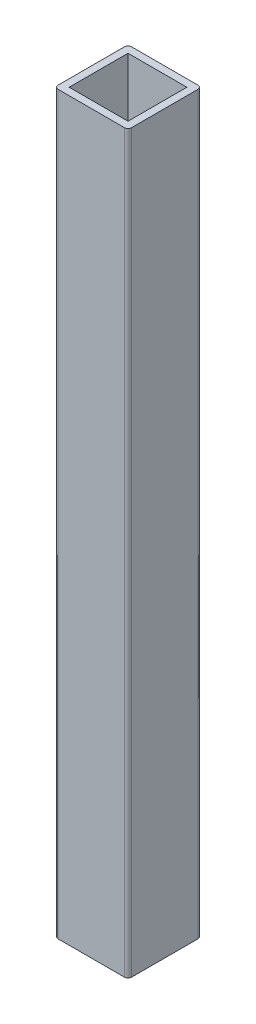
ISO-10303-21;
HEADER;
FILE_DESCRIPTION(('STEP AP214'),'2;1');
FILE_NAME('part.step','',(''),(''),'','','');
FILE_SCHEMA(('AUTOMOTIVE_DESIGN { 1 0 10303 214 1 1 1 1 }'));
ENDSEC;
DATA;
#1=APPLICATION_CONTEXT('core data for automotive mechanical design processes');
#2=APPLICATION_PROTOCOL_DEFINITION('international standard','automotive_design',2000,#1);
#3=PRODUCT_CONTEXT('',#1,'mechanical');
#4=PRODUCT('Part','Part','',(#3));
#5=PRODUCT_RELATED_PRODUCT_CATEGORY('part','',(#4));
#6=PRODUCT_DEFINITION_FORMATION('','',#4);
#7=PRODUCT_DEFINITION_CONTEXT('part definition',#1,'design');
#8=PRODUCT_DEFINITION('design','',#6,#7);
#9=PRODUCT_DEFINITION_SHAPE('','',#8);
#10=(LENGTH_UNIT() NAMED_UNIT(*) SI_UNIT(.MILLI.,.METRE.));
#11=(NAMED_UNIT(*) PLANE_ANGLE_UNIT() SI_UNIT($,.RADIAN.));
#12=(NAMED_UNIT(*) SI_UNIT($,.STERADIAN.) SOLID_ANGLE_UNIT());
#13=UNCERTAINTY_MEASURE_WITH_UNIT(LENGTH_MEASURE(1.E-05),#10,'distance_accuracy_value','');
#14=(GEOMETRIC_REPRESENTATION_CONTEXT(3) GLOBAL_UNCERTAINTY_ASSIGNED_CONTEXT((#13)) GLOBAL_UNIT_ASSIGNED_CONTEXT((#10,
#11,#12)) REPRESENTATION_CONTEXT('',''));
#15=CARTESIAN_POINT('',(0.,0.,0.));
#16=DIRECTION('',(0.,0.,1.));
#17=DIRECTION('',(1.,0.,0.));
#18=AXIS2_PLACEMENT_3D('',#15,#16,#17);
#19=CARTESIAN_POINT('',(0.,200.,0.));
#20=DIRECTION('',(0.,1.,0.));
#21=DIRECTION('',(0.,0.,1.));
#22=AXIS2_PLACEMENT_3D('',#19,#20,#21);
#23=PLANE('',#22);
#24=DIRECTION('',(0.,0.,-1.));
#25=VECTOR('',#24,1.);
#26=CARTESIAN_POINT('',(10.8433734939759,200.,-8.19277108433735));
#27=LINE('',#26,#25);
#28=CARTESIAN_POINT('',(10.8433734939759,200.,10.8072289156627));
#29=VERTEX_POINT('',#28);
#30=CARTESIAN_POINT('',(10.8433734939759,200.,-7.19277108433735));
#31=VERTEX_POINT('',#30);
#32=EDGE_CURVE('E197',#29,#31,#27,.T.);
#33=ORIENTED_EDGE('',*,*,#32,.T.);
#34=CARTESIAN_POINT('',(9.84337349397594,200.,-7.19277108433735));
#35=DIRECTION('',(0.,1.,0.));
#36=DIRECTION('',(0.,0.,1.));
#37=AXIS2_PLACEMENT_3D('',#34,#35,#36);
#38=CIRCLE('',#37,1.);
#39=CARTESIAN_POINT('',(9.84337349397594,200.,-8.19277108433735));
#40=VERTEX_POINT('',#39);
#41=EDGE_CURVE('E252',#31,#40,#38,.T.);
#42=ORIENTED_EDGE('',*,*,#41,.T.);
#43=DIRECTION('',(-1.,0.,0.));
#44=VECTOR('',#43,1.);
#45=CARTESIAN_POINT('',(-9.15662650602406,200.,-8.19277108433735));
#46=LINE('',#45,#44);
#47=CARTESIAN_POINT('',(-8.15662650602406,200.,-8.19277108433735));
#48=VERTEX_POINT('',#47);
#49=EDGE_CURVE('E201',#40,#48,#46,.T.);
#50=ORIENTED_EDGE('',*,*,#49,.T.);
#51=CARTESIAN_POINT('',(-8.15662650602406,200.,-7.19277108433735));
#52=DIRECTION('',(0.,1.,0.));
#53=DIRECTION('',(0.,0.,1.));
#54=AXIS2_PLACEMENT_3D('',#51,#52,#53);
#55=CIRCLE('',#54,1.);
#56=CARTESIAN_POINT('',(-9.15662650602406,200.,-7.19277108433735));
#57=VERTEX_POINT('',#56);
#58=EDGE_CURVE('E244',#48,#57,#55,.T.);
#59=ORIENTED_EDGE('',*,*,#58,.T.);
#60=DIRECTION('',(0.,0.,1.));
#61=VECTOR('',#60,1.);
#62=CARTESIAN_POINT('',(-9.15662650602406,200.,-8.19277108433735));
#63=LINE('',#62,#61);
#64=CARTESIAN_POINT('',(-9.15662650602406,200.,10.8072289156627));
#65=VERTEX_POINT('',#64);
#66=EDGE_CURVE('E190',#57,#65,#63,.T.);
#67=ORIENTED_EDGE('',*,*,#66,.T.);
#68=CARTESIAN_POINT('',(-8.15662650602406,200.,10.8072289156627));
#69=DIRECTION('',(0.,1.,0.));
#70=DIRECTION('',(0.,0.,1.));
#71=AXIS2_PLACEMENT_3D('',#68,#69,#70);
#72=CIRCLE('',#71,1.);
#73=CARTESIAN_POINT('',(-8.15662650602406,200.,11.8072289156627));
#74=VERTEX_POINT('',#73);
#75=EDGE_CURVE('E68',#65,#74,#72,.T.);
#76=ORIENTED_EDGE('',*,*,#75,.T.);
#77=DIRECTION('',(1.,0.,0.));
#78=VECTOR('',#77,1.);
#79=CARTESIAN_POINT('',(-9.15662650602406,200.,11.8072289156627));
#80=LINE('',#79,#78);
#81=CARTESIAN_POINT('',(9.84337349397594,200.,11.8072289156627));
#82=VERTEX_POINT('',#81);
#83=EDGE_CURVE('E193',#74,#82,#80,.T.);
#84=ORIENTED_EDGE('',*,*,#83,.T.);
#85=CARTESIAN_POINT('',(9.84337349397594,200.,10.8072289156627));
#86=DIRECTION('',(0.,1.,0.));
#87=DIRECTION('',(0.,0.,1.));
#88=AXIS2_PLACEMENT_3D('',#85,#86,#87);
#89=CIRCLE('',#88,1.);
#90=EDGE_CURVE('E249',#82,#29,#89,.T.);
#91=ORIENTED_EDGE('',*,*,#90,.T.);
#92=EDGE_LOOP('',(#33,#42,#50,#59,#67,#76,#84,#91));
#93=FACE_BOUND('',#92,.T.);
#94=DIRECTION('',(0.,0.,1.));
#95=VECTOR('',#94,1.);
#96=CARTESIAN_POINT('',(-7.15662650602406,200.,-6.19277108433735));
#97=LINE('',#96,#95);
#98=CARTESIAN_POINT('',(-7.15662650602406,200.,-6.19277108433735));
#99=VERTEX_POINT('',#98);
#100=CARTESIAN_POINT('',(-7.15662650602406,200.,9.80722891566265));
#101=VERTEX_POINT('',#100);
#102=EDGE_CURVE('E148',#99,#101,#97,.T.);
#103=ORIENTED_EDGE('',*,*,#102,.F.);
#104=DIRECTION('',(-1.,0.,0.));
#105=VECTOR('',#104,1.);
#106=CARTESIAN_POINT('',(-7.15662650602406,200.,-6.19277108433735));
#107=LINE('',#106,#105);
#108=CARTESIAN_POINT('',(8.84337349397594,200.,-6.19277108433735));
#109=VERTEX_POINT('',#108);
#110=EDGE_CURVE('E137',#109,#99,#107,.T.);
#111=ORIENTED_EDGE('',*,*,#110,.F.);
#112=DIRECTION('',(0.,0.,-1.));
#113=VECTOR('',#112,1.);
#114=CARTESIAN_POINT('',(8.84337349397594,200.,-6.19277108433735));
#115=LINE('',#114,#113);
#116=CARTESIAN_POINT('',(8.84337349397594,200.,9.80722891566266));
#117=VERTEX_POINT('',#116);
#118=EDGE_CURVE('E166',#117,#109,#115,.T.);
#119=ORIENTED_EDGE('',*,*,#118,.F.);
#120=DIRECTION('',(1.,0.,0.));
#121=VECTOR('',#120,1.);
#122=CARTESIAN_POINT('',(-7.15662650602406,200.,9.80722891566265));
#123=LINE('',#122,#121);
#124=EDGE_CURVE('E162',#101,#117,#123,.T.);
#125=ORIENTED_EDGE('',*,*,#124,.F.);
#126=EDGE_LOOP('',(#103,#111,#119,#125));
#127=FACE_BOUND('',#126,.T.);
#128=ADVANCED_FACE('F45',(#93,#127),#23,.T.);
#129=CARTESIAN_POINT('',(0.,0.,0.));
#130=DIRECTION('',(0.,1.,0.));
#131=DIRECTION('',(0.,0.,1.));
#132=AXIS2_PLACEMENT_3D('',#129,#130,#131);
#133=PLANE('',#132);
#134=DIRECTION('',(-1.,0.,0.));
#135=VECTOR('',#134,1.);
#136=CARTESIAN_POINT('',(-9.15662650602406,0.,-8.19277108433735));
#137=LINE('',#136,#135);
#138=CARTESIAN_POINT('',(9.84337349397594,0.,-8.19277108433735));
#139=VERTEX_POINT('',#138);
#140=CARTESIAN_POINT('',(-8.15662650602406,0.,-8.19277108433735));
#141=VERTEX_POINT('',#140);
#142=EDGE_CURVE('E194',#139,#141,#137,.T.);
#143=ORIENTED_EDGE('',*,*,#142,.F.);
#144=CARTESIAN_POINT('',(9.84337349397594,0.,-7.19277108433735));
#145=DIRECTION('',(0.,1.,0.));
#146=DIRECTION('',(0.,0.,1.));
#147=AXIS2_PLACEMENT_3D('',#144,#145,#146);
#148=CIRCLE('',#147,1.);
#149=CARTESIAN_POINT('',(10.8433734939759,0.,-7.19277108433735));
#150=VERTEX_POINT('',#149);
#151=EDGE_CURVE('E234',#139,#150,#148,.F.);
#152=ORIENTED_EDGE('',*,*,#151,.T.);
#153=DIRECTION('',(0.,0.,-1.));
#154=VECTOR('',#153,1.);
#155=CARTESIAN_POINT('',(10.8433734939759,0.,-8.19277108433735));
#156=LINE('',#155,#154);
#157=CARTESIAN_POINT('',(10.8433734939759,0.,10.8072289156627));
#158=VERTEX_POINT('',#157);
#159=EDGE_CURVE('E212',#158,#150,#156,.T.);
#160=ORIENTED_EDGE('',*,*,#159,.F.);
#161=CARTESIAN_POINT('',(9.84337349397594,0.,10.8072289156627));
#162=DIRECTION('',(0.,1.,0.));
#163=DIRECTION('',(0.,0.,1.));
#164=AXIS2_PLACEMENT_3D('',#161,#162,#163);
#165=CIRCLE('',#164,1.);
#166=CARTESIAN_POINT('',(9.84337349397594,0.,11.8072289156627));
#167=VERTEX_POINT('',#166);
#168=EDGE_CURVE('E231',#158,#167,#165,.F.);
#169=ORIENTED_EDGE('',*,*,#168,.T.);
#170=DIRECTION('',(1.,0.,0.));
#171=VECTOR('',#170,1.);
#172=CARTESIAN_POINT('',(-9.15662650602406,0.,11.8072289156627));
#173=LINE('',#172,#171);
#174=CARTESIAN_POINT('',(-8.15662650602406,0.,11.8072289156627));
#175=VERTEX_POINT('',#174);
#176=EDGE_CURVE('E209',#175,#167,#173,.T.);
#177=ORIENTED_EDGE('',*,*,#176,.F.);
#178=CARTESIAN_POINT('',(-8.15662650602406,0.,10.8072289156627));
#179=DIRECTION('',(0.,1.,0.));
#180=DIRECTION('',(0.,0.,1.));
#181=AXIS2_PLACEMENT_3D('',#178,#179,#180);
#182=CIRCLE('',#181,1.);
#183=CARTESIAN_POINT('',(-9.15662650602406,0.,10.8072289156627));
#184=VERTEX_POINT('',#183);
#185=EDGE_CURVE('E228',#175,#184,#182,.F.);
#186=ORIENTED_EDGE('',*,*,#185,.T.);
#187=DIRECTION('',(0.,0.,1.));
#188=VECTOR('',#187,1.);
#189=CARTESIAN_POINT('',(-9.15662650602406,0.,-8.19277108433735));
#190=LINE('',#189,#188);
#191=CARTESIAN_POINT('',(-9.15662650602406,0.,-7.19277108433735));
#192=VERTEX_POINT('',#191);
#193=EDGE_CURVE('E157',#192,#184,#190,.T.);
#194=ORIENTED_EDGE('',*,*,#193,.F.);
#195=CARTESIAN_POINT('',(-8.15662650602406,0.,-7.19277108433735));
#196=DIRECTION('',(0.,1.,0.));
#197=DIRECTION('',(0.,0.,1.));
#198=AXIS2_PLACEMENT_3D('',#195,#196,#197);
#199=CIRCLE('',#198,1.);
#200=EDGE_CURVE('E225',#192,#141,#199,.F.);
#201=ORIENTED_EDGE('',*,*,#200,.T.);
#202=EDGE_LOOP('',(#143,#152,#160,#169,#177,#186,#194,#201));
#203=FACE_BOUND('',#202,.T.);
#204=DIRECTION('',(-1.,0.,0.));
#205=VECTOR('',#204,1.);
#206=CARTESIAN_POINT('',(-7.15662650602406,0.,-6.19277108433735));
#207=LINE('',#206,#205);
#208=CARTESIAN_POINT('',(8.84337349397594,0.,-6.19277108433735));
#209=VERTEX_POINT('',#208);
#210=CARTESIAN_POINT('',(-7.15662650602406,0.,-6.19277108433735));
#211=VERTEX_POINT('',#210);
#212=EDGE_CURVE('E171',#209,#211,#207,.T.);
#213=ORIENTED_EDGE('',*,*,#212,.T.);
#214=DIRECTION('',(0.,0.,1.));
#215=VECTOR('',#214,1.);
#216=CARTESIAN_POINT('',(-7.15662650602406,0.,-6.19277108433735));
#217=LINE('',#216,#215);
#218=CARTESIAN_POINT('',(-7.15662650602406,0.,9.80722891566265));
#219=VERTEX_POINT('',#218);
#220=EDGE_CURVE('E155',#211,#219,#217,.T.);
#221=ORIENTED_EDGE('',*,*,#220,.T.);
#222=DIRECTION('',(1.,0.,0.));
#223=VECTOR('',#222,1.);
#224=CARTESIAN_POINT('',(-7.15662650602406,0.,9.80722891566265));
#225=LINE('',#224,#223);
#226=CARTESIAN_POINT('',(8.84337349397594,0.,9.80722891566266));
#227=VERTEX_POINT('',#226);
#228=EDGE_CURVE('E176',#219,#227,#225,.T.);
#229=ORIENTED_EDGE('',*,*,#228,.T.);
#230=DIRECTION('',(0.,0.,-1.));
#231=VECTOR('',#230,1.);
#232=CARTESIAN_POINT('',(8.84337349397594,0.,-6.19277108433735));
#233=LINE('',#232,#231);
#234=EDGE_CURVE('E149',#227,#209,#233,.T.);
#235=ORIENTED_EDGE('',*,*,#234,.T.);
#236=EDGE_LOOP('',(#213,#221,#229,#235));
#237=FACE_BOUND('',#236,.T.);
#238=ADVANCED_FACE('F272',(#203,#237),#133,.F.);
#239=CARTESIAN_POINT('',(-9.15662650602406,200.,-8.19277108433735));
#240=DIRECTION('',(1.,0.,0.));
#241=DIRECTION('',(0.,0.,-1.));
#242=AXIS2_PLACEMENT_3D('',#239,#240,#241);
#243=PLANE('',#242);
#244=ORIENTED_EDGE('',*,*,#193,.T.);
#245=DIRECTION('',(0.,-1.,0.));
#246=VECTOR('',#245,1.);
#247=CARTESIAN_POINT('',(-9.15662650602406,200.,10.8072289156627));
#248=LINE('',#247,#246);
#249=EDGE_CURVE('E11',#184,#65,#248,.F.);
#250=ORIENTED_EDGE('',*,*,#249,.T.);
#251=ORIENTED_EDGE('',*,*,#66,.F.);
#252=DIRECTION('',(0.,-1.,0.));
#253=VECTOR('',#252,1.);
#254=CARTESIAN_POINT('',(-9.15662650602406,200.,-7.19277108433735));
#255=LINE('',#254,#253);
#256=EDGE_CURVE('E54',#57,#192,#255,.T.);
#257=ORIENTED_EDGE('',*,*,#256,.T.);
#258=EDGE_LOOP('',(#244,#250,#251,#257));
#259=FACE_BOUND('',#258,.T.);
#260=ADVANCED_FACE('F266',(#259),#243,.F.);
#261=CARTESIAN_POINT('',(-9.15662650602406,200.,11.8072289156627));
#262=DIRECTION('',(0.,0.,-1.));
#263=DIRECTION('',(-1.,0.,0.));
#264=AXIS2_PLACEMENT_3D('',#261,#262,#263);
#265=PLANE('',#264);
#266=ORIENTED_EDGE('',*,*,#176,.T.);
#267=DIRECTION('',(0.,-1.,0.));
#268=VECTOR('',#267,1.);
#269=CARTESIAN_POINT('',(9.84337349397594,200.,11.8072289156627));
#270=LINE('',#269,#268);
#271=EDGE_CURVE('E61',#167,#82,#270,.F.);
#272=ORIENTED_EDGE('',*,*,#271,.T.);
#273=ORIENTED_EDGE('',*,*,#83,.F.);
#274=DIRECTION('',(0.,-1.,0.));
#275=VECTOR('',#274,1.);
#276=CARTESIAN_POINT('',(-8.15662650602406,200.,11.8072289156627));
#277=LINE('',#276,#275);
#278=EDGE_CURVE('E255',#74,#175,#277,.T.);
#279=ORIENTED_EDGE('',*,*,#278,.T.);
#280=EDGE_LOOP('',(#266,#272,#273,#279));
#281=FACE_BOUND('',#280,.T.);
#282=ADVANCED_FACE('F278',(#281),#265,.F.);
#283=CARTESIAN_POINT('',(10.8433734939759,200.,-8.19277108433735));
#284=DIRECTION('',(-1.,0.,0.));
#285=DIRECTION('',(0.,0.,1.));
#286=AXIS2_PLACEMENT_3D('',#283,#284,#285);
#287=PLANE('',#286);
#288=ORIENTED_EDGE('',*,*,#159,.T.);
#289=DIRECTION('',(0.,-1.,0.));
#290=VECTOR('',#289,1.);
#291=CARTESIAN_POINT('',(10.8433734939759,200.,-7.19277108433735));
#292=LINE('',#291,#290);
#293=EDGE_CURVE('E241',#150,#31,#292,.F.);
#294=ORIENTED_EDGE('',*,*,#293,.T.);
#295=ORIENTED_EDGE('',*,*,#32,.F.);
#296=DIRECTION('',(0.,-1.,0.));
#297=VECTOR('',#296,1.);
#298=CARTESIAN_POINT('',(10.8433734939759,200.,10.8072289156627));
#299=LINE('',#298,#297);
#300=EDGE_CURVE('E237',#29,#158,#299,.T.);
#301=ORIENTED_EDGE('',*,*,#300,.T.);
#302=EDGE_LOOP('',(#288,#294,#295,#301));
#303=FACE_BOUND('',#302,.T.);
#304=ADVANCED_FACE('F286',(#303),#287,.F.);
#305=CARTESIAN_POINT('',(-9.15662650602406,200.,-8.19277108433735));
#306=DIRECTION('',(0.,0.,1.));
#307=DIRECTION('',(1.,0.,0.));
#308=AXIS2_PLACEMENT_3D('',#305,#306,#307);
#309=PLANE('',#308);
#310=ORIENTED_EDGE('',*,*,#49,.F.);
#311=DIRECTION('',(0.,-1.,0.));
#312=VECTOR('',#311,1.);
#313=CARTESIAN_POINT('',(9.84337349397594,200.,-8.19277108433735));
#314=LINE('',#313,#312);
#315=EDGE_CURVE('E221',#40,#139,#314,.T.);
#316=ORIENTED_EDGE('',*,*,#315,.T.);
#317=ORIENTED_EDGE('',*,*,#142,.T.);
#318=DIRECTION('',(0.,-1.,0.));
#319=VECTOR('',#318,1.);
#320=CARTESIAN_POINT('',(-8.15662650602406,200.,-8.19277108433735));
#321=LINE('',#320,#319);
#322=EDGE_CURVE('E205',#141,#48,#321,.F.);
#323=ORIENTED_EDGE('',*,*,#322,.T.);
#324=EDGE_LOOP('',(#310,#316,#317,#323));
#325=FACE_BOUND('',#324,.T.);
#326=ADVANCED_FACE('F294',(#325),#309,.F.);
#327=CARTESIAN_POINT('',(-7.15662650602406,200.,-6.19277108433735));
#328=DIRECTION('',(0.,0.,1.));
#329=DIRECTION('',(1.,0.,0.));
#330=AXIS2_PLACEMENT_3D('',#327,#328,#329);
#331=PLANE('',#330);
#332=ORIENTED_EDGE('',*,*,#212,.F.);
#333=DIRECTION('',(0.,-1.,0.));
#334=VECTOR('',#333,1.);
#335=CARTESIAN_POINT('',(8.84337349397594,200.,-6.19277108433735));
#336=LINE('',#335,#334);
#337=EDGE_CURVE('E143',#109,#209,#336,.T.);
#338=ORIENTED_EDGE('',*,*,#337,.F.);
#339=ORIENTED_EDGE('',*,*,#110,.T.);
#340=DIRECTION('',(0.,-1.,0.));
#341=VECTOR('',#340,1.);
#342=CARTESIAN_POINT('',(-7.15662650602406,200.,-6.19277108433735));
#343=LINE('',#342,#341);
#344=EDGE_CURVE('E140',#99,#211,#343,.T.);
#345=ORIENTED_EDGE('',*,*,#344,.T.);
#346=EDGE_LOOP('',(#332,#338,#339,#345));
#347=FACE_BOUND('',#346,.T.);
#348=ADVANCED_FACE('F139',(#347),#331,.T.);
#349=CARTESIAN_POINT('',(-7.15662650602406,200.,-6.19277108433735));
#350=DIRECTION('',(1.,0.,0.));
#351=DIRECTION('',(0.,0.,-1.));
#352=AXIS2_PLACEMENT_3D('',#349,#350,#351);
#353=PLANE('',#352);
#354=ORIENTED_EDGE('',*,*,#220,.F.);
#355=ORIENTED_EDGE('',*,*,#344,.F.);
#356=ORIENTED_EDGE('',*,*,#102,.T.);
#357=DIRECTION('',(0.,-1.,0.));
#358=VECTOR('',#357,1.);
#359=CARTESIAN_POINT('',(-7.15662650602406,200.,9.80722891566265));
#360=LINE('',#359,#358);
#361=EDGE_CURVE('E158',#101,#219,#360,.T.);
#362=ORIENTED_EDGE('',*,*,#361,.T.);
#363=EDGE_LOOP('',(#354,#355,#356,#362));
#364=FACE_BOUND('',#363,.T.);
#365=ADVANCED_FACE('F152',(#364),#353,.T.);
#366=CARTESIAN_POINT('',(-7.15662650602406,200.,9.80722891566265));
#367=DIRECTION('',(0.,0.,-1.));
#368=DIRECTION('',(-1.,0.,0.));
#369=AXIS2_PLACEMENT_3D('',#366,#367,#368);
#370=PLANE('',#369);
#371=ORIENTED_EDGE('',*,*,#228,.F.);
#372=ORIENTED_EDGE('',*,*,#361,.F.);
#373=ORIENTED_EDGE('',*,*,#124,.T.);
#374=DIRECTION('',(0.,-1.,0.));
#375=VECTOR('',#374,1.);
#376=CARTESIAN_POINT('',(8.84337349397594,200.,9.80722891566266));
#377=LINE('',#376,#375);
#378=EDGE_CURVE('E185',#117,#227,#377,.T.);
#379=ORIENTED_EDGE('',*,*,#378,.T.);
#380=EDGE_LOOP('',(#371,#372,#373,#379));
#381=FACE_BOUND('',#380,.T.);
#382=ADVANCED_FACE('F348',(#381),#370,.T.);
#383=CARTESIAN_POINT('',(8.84337349397594,200.,-6.19277108433735));
#384=DIRECTION('',(-1.,0.,0.));
#385=DIRECTION('',(0.,0.,1.));
#386=AXIS2_PLACEMENT_3D('',#383,#384,#385);
#387=PLANE('',#386);
#388=ORIENTED_EDGE('',*,*,#234,.F.);
#389=ORIENTED_EDGE('',*,*,#378,.F.);
#390=ORIENTED_EDGE('',*,*,#118,.T.);
#391=ORIENTED_EDGE('',*,*,#337,.T.);
#392=EDGE_LOOP('',(#388,#389,#390,#391));
#393=FACE_BOUND('',#392,.T.);
#394=ADVANCED_FACE('F320',(#393),#387,.T.);
#395=CARTESIAN_POINT('',(9.84337349397594,200.,-7.19277108433735));
#396=DIRECTION('',(0.,-1.,0.));
#397=DIRECTION('',(0.,0.,-1.));
#398=AXIS2_PLACEMENT_3D('',#395,#396,#397);
#399=CYLINDRICAL_SURFACE('',#398,1.);
#400=ORIENTED_EDGE('',*,*,#41,.F.);
#401=ORIENTED_EDGE('',*,*,#293,.F.);
#402=ORIENTED_EDGE('',*,*,#151,.F.);
#403=ORIENTED_EDGE('',*,*,#315,.F.);
#404=EDGE_LOOP('',(#400,#401,#402,#403));
#405=FACE_BOUND('',#404,.T.);
#406=ADVANCED_FACE('F291',(#405),#399,.T.);
#407=CARTESIAN_POINT('',(9.84337349397594,200.,10.8072289156627));
#408=DIRECTION('',(0.,-1.,0.));
#409=DIRECTION('',(0.,0.,-1.));
#410=AXIS2_PLACEMENT_3D('',#407,#408,#409);
#411=CYLINDRICAL_SURFACE('',#410,1.);
#412=ORIENTED_EDGE('',*,*,#90,.F.);
#413=ORIENTED_EDGE('',*,*,#271,.F.);
#414=ORIENTED_EDGE('',*,*,#168,.F.);
#415=ORIENTED_EDGE('',*,*,#300,.F.);
#416=EDGE_LOOP('',(#412,#413,#414,#415));
#417=FACE_BOUND('',#416,.T.);
#418=ADVANCED_FACE('F283',(#417),#411,.T.);
#419=CARTESIAN_POINT('',(-8.15662650602406,200.,10.8072289156627));
#420=DIRECTION('',(0.,-1.,0.));
#421=DIRECTION('',(0.,0.,-1.));
#422=AXIS2_PLACEMENT_3D('',#419,#420,#421);
#423=CYLINDRICAL_SURFACE('',#422,1.);
#424=ORIENTED_EDGE('',*,*,#75,.F.);
#425=ORIENTED_EDGE('',*,*,#249,.F.);
#426=ORIENTED_EDGE('',*,*,#185,.F.);
#427=ORIENTED_EDGE('',*,*,#278,.F.);
#428=EDGE_LOOP('',(#424,#425,#426,#427));
#429=FACE_BOUND('',#428,.T.);
#430=ADVANCED_FACE('F277',(#429),#423,.T.);
#431=CARTESIAN_POINT('',(-8.15662650602406,200.,-7.19277108433735));
#432=DIRECTION('',(0.,-1.,0.));
#433=DIRECTION('',(0.,0.,-1.));
#434=AXIS2_PLACEMENT_3D('',#431,#432,#433);
#435=CYLINDRICAL_SURFACE('',#434,1.);
#436=ORIENTED_EDGE('',*,*,#58,.F.);
#437=ORIENTED_EDGE('',*,*,#322,.F.);
#438=ORIENTED_EDGE('',*,*,#200,.F.);
#439=ORIENTED_EDGE('',*,*,#256,.F.);
#440=EDGE_LOOP('',(#436,#437,#438,#439));
#441=FACE_BOUND('',#440,.T.);
#442=ADVANCED_FACE('F47',(#441),#435,.T.);
#443=CLOSED_SHELL('',(#128,#238,#260,#282,#304,#326,#348,#365,#382,#394,#406,#418,#430,#442));
#444=MANIFOLD_SOLID_BREP('B2',#443);
#445=ADVANCED_BREP_SHAPE_REPRESENTATION('',(#18,#444),#14);
#446=SHAPE_DEFINITION_REPRESENTATION(#9,#445);
ENDSEC;
END-ISO-10303-21;
